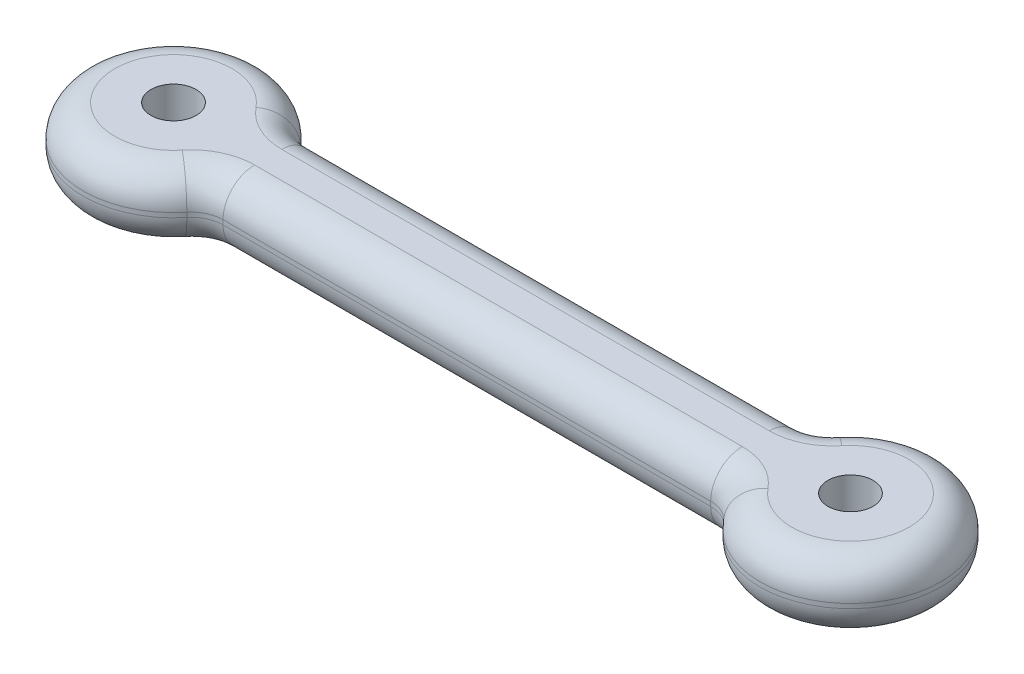
ISO-10303-21;
HEADER;
FILE_DESCRIPTION(('STEP AP214'),'2;1');
FILE_NAME('part.step','',(''),(''),'','','');
FILE_SCHEMA(('AUTOMOTIVE_DESIGN { 1 0 10303 214 1 1 1 1 }'));
ENDSEC;
DATA;
#1=APPLICATION_CONTEXT('core data for automotive mechanical design processes');
#2=APPLICATION_PROTOCOL_DEFINITION('international standard','automotive_design',2000,#1);
#3=PRODUCT_CONTEXT('',#1,'mechanical');
#4=PRODUCT('Part','Part','',(#3));
#5=PRODUCT_RELATED_PRODUCT_CATEGORY('part','',(#4));
#6=PRODUCT_DEFINITION_FORMATION('','',#4);
#7=PRODUCT_DEFINITION_CONTEXT('part definition',#1,'design');
#8=PRODUCT_DEFINITION('design','',#6,#7);
#9=PRODUCT_DEFINITION_SHAPE('','',#8);
#10=(LENGTH_UNIT() NAMED_UNIT(*) SI_UNIT(.MILLI.,.METRE.));
#11=(NAMED_UNIT(*) PLANE_ANGLE_UNIT() SI_UNIT($,.RADIAN.));
#12=(NAMED_UNIT(*) SI_UNIT($,.STERADIAN.) SOLID_ANGLE_UNIT());
#13=UNCERTAINTY_MEASURE_WITH_UNIT(LENGTH_MEASURE(1.E-05),#10,'distance_accuracy_value','');
#14=(GEOMETRIC_REPRESENTATION_CONTEXT(3) GLOBAL_UNCERTAINTY_ASSIGNED_CONTEXT((#13)) GLOBAL_UNIT_ASSIGNED_CONTEXT((#10,
#11,#12)) REPRESENTATION_CONTEXT('',''));
#15=CARTESIAN_POINT('',(0.,0.,0.));
#16=DIRECTION('',(0.,0.,1.));
#17=DIRECTION('',(1.,0.,0.));
#18=AXIS2_PLACEMENT_3D('',#15,#16,#17);
#19=CARTESIAN_POINT('',(-15.,6.,0.));
#20=DIRECTION('',(0.,1.,0.));
#21=DIRECTION('',(0.,0.,1.));
#22=AXIS2_PLACEMENT_3D('',#19,#20,#21);
#23=PLANE('',#22);
#24=CARTESIAN_POINT('',(15.,6.,0.));
#25=DIRECTION('',(0.,1.,0.));
#26=DIRECTION('',(0.,0.,1.));
#27=AXIS2_PLACEMENT_3D('',#24,#25,#26);
#28=CIRCLE('',#27,0.999999999999998);
#29=CARTESIAN_POINT('',(15.,6.,0.999999999999997));
#30=VERTEX_POINT('',#29);
#31=EDGE_CURVE('E156',#30,#30,#28,.T.);
#32=ORIENTED_EDGE('',*,*,#31,.T.);
#33=EDGE_LOOP('',(#32));
#34=FACE_BOUND('',#33,.T.);
#35=CARTESIAN_POINT('',(-15.,6.,0.));
#36=DIRECTION('',(0.,1.,0.));
#37=DIRECTION('',(0.,0.,1.));
#38=AXIS2_PLACEMENT_3D('',#35,#36,#37);
#39=CIRCLE('',#38,0.999999999999998);
#40=CARTESIAN_POINT('',(-15.,6.,0.999999999999997));
#41=VERTEX_POINT('',#40);
#42=EDGE_CURVE('E303',#41,#41,#39,.T.);
#43=ORIENTED_EDGE('',*,*,#42,.T.);
#44=EDGE_LOOP('',(#43));
#45=FACE_BOUND('',#44,.T.);
#46=CARTESIAN_POINT('',(10.8047646073194,6.,-3.4));
#47=DIRECTION('',(0.,1.,0.));
#48=DIRECTION('',(0.,0.,1.));
#49=AXIS2_PLACEMENT_3D('',#46,#47,#48);
#50=CIRCLE('',#49,2.8);
#51=CARTESIAN_POINT('',(12.9800718479686,6.,-1.63703703703704));
#52=VERTEX_POINT('',#51);
#53=CARTESIAN_POINT('',(10.8047646073194,6.,-0.6));
#54=VERTEX_POINT('',#53);
#55=EDGE_CURVE('E215',#52,#54,#50,.F.);
#56=ORIENTED_EDGE('',*,*,#55,.F.);
#57=CARTESIAN_POINT('',(15.,6.,0.));
#58=DIRECTION('',(0.,1.,0.));
#59=DIRECTION('',(0.,0.,1.));
#60=AXIS2_PLACEMENT_3D('',#57,#58,#59);
#61=CIRCLE('',#60,2.6);
#62=CARTESIAN_POINT('',(12.9800718479686,6.,1.63703703703704));
#63=VERTEX_POINT('',#62);
#64=EDGE_CURVE('E212',#52,#63,#61,.F.);
#65=ORIENTED_EDGE('',*,*,#64,.T.);
#66=CARTESIAN_POINT('',(10.8047646073194,6.,3.4));
#67=DIRECTION('',(0.,1.,0.));
#68=DIRECTION('',(0.,0.,1.));
#69=AXIS2_PLACEMENT_3D('',#66,#67,#68);
#70=CIRCLE('',#69,2.8);
#71=CARTESIAN_POINT('',(10.8047646073194,6.,0.599999999999998));
#72=VERTEX_POINT('',#71);
#73=EDGE_CURVE('E210',#72,#63,#70,.F.);
#74=ORIENTED_EDGE('',*,*,#73,.F.);
#75=DIRECTION('',(1.,0.,0.));
#76=VECTOR('',#75,1.);
#77=CARTESIAN_POINT('',(-15.,6.,0.599999999999998));
#78=LINE('',#77,#76);
#79=CARTESIAN_POINT('',(-10.8047646073194,6.,0.599999999999998));
#80=VERTEX_POINT('',#79);
#81=EDGE_CURVE('E206',#72,#80,#78,.F.);
#82=ORIENTED_EDGE('',*,*,#81,.T.);
#83=CARTESIAN_POINT('',(-10.8047646073194,6.,3.4));
#84=DIRECTION('',(0.,1.,0.));
#85=DIRECTION('',(0.,0.,1.));
#86=AXIS2_PLACEMENT_3D('',#83,#84,#85);
#87=CIRCLE('',#86,2.8);
#88=CARTESIAN_POINT('',(-12.9800718479686,6.,1.63703703703704));
#89=VERTEX_POINT('',#88);
#90=EDGE_CURVE('E203',#89,#80,#87,.F.);
#91=ORIENTED_EDGE('',*,*,#90,.F.);
#92=CARTESIAN_POINT('',(-15.,6.,0.));
#93=DIRECTION('',(0.,1.,0.));
#94=DIRECTION('',(0.,0.,1.));
#95=AXIS2_PLACEMENT_3D('',#92,#93,#94);
#96=CIRCLE('',#95,2.6);
#97=CARTESIAN_POINT('',(-12.9800718479686,6.,-1.63703703703704));
#98=VERTEX_POINT('',#97);
#99=EDGE_CURVE('E201',#89,#98,#96,.F.);
#100=ORIENTED_EDGE('',*,*,#99,.T.);
#101=CARTESIAN_POINT('',(-10.8047646073194,6.,-3.4));
#102=DIRECTION('',(0.,1.,0.));
#103=DIRECTION('',(0.,0.,1.));
#104=AXIS2_PLACEMENT_3D('',#101,#102,#103);
#105=CIRCLE('',#104,2.8);
#106=CARTESIAN_POINT('',(-10.8047646073194,6.,-0.6));
#107=VERTEX_POINT('',#106);
#108=EDGE_CURVE('E198',#107,#98,#105,.F.);
#109=ORIENTED_EDGE('',*,*,#108,.F.);
#110=DIRECTION('',(-1.,0.,0.));
#111=VECTOR('',#110,1.);
#112=CARTESIAN_POINT('',(-15.,6.,-0.6));
#113=LINE('',#112,#111);
#114=EDGE_CURVE('E208',#107,#54,#113,.F.);
#115=ORIENTED_EDGE('',*,*,#114,.T.);
#116=EDGE_LOOP('',(#56,#65,#74,#82,#91,#100,#109,#115));
#117=FACE_BOUND('',#116,.T.);
#118=ADVANCED_FACE('F34',(#34,#45,#117),#23,.F.);
#119=CARTESIAN_POINT('',(-15.,9.,0.));
#120=DIRECTION('',(0.,1.,0.));
#121=DIRECTION('',(0.,0.,1.));
#122=AXIS2_PLACEMENT_3D('',#119,#120,#121);
#123=PLANE('',#122);
#124=CARTESIAN_POINT('',(15.,9.,0.));
#125=DIRECTION('',(0.,1.,0.));
#126=DIRECTION('',(0.,0.,1.));
#127=AXIS2_PLACEMENT_3D('',#124,#125,#126);
#128=CIRCLE('',#127,0.999999999999998);
#129=CARTESIAN_POINT('',(15.,9.,0.999999999999997));
#130=VERTEX_POINT('',#129);
#131=EDGE_CURVE('E308',#130,#130,#128,.T.);
#132=ORIENTED_EDGE('',*,*,#131,.F.);
#133=EDGE_LOOP('',(#132));
#134=FACE_BOUND('',#133,.T.);
#135=CARTESIAN_POINT('',(-15.,9.,0.));
#136=DIRECTION('',(0.,1.,0.));
#137=DIRECTION('',(0.,0.,1.));
#138=AXIS2_PLACEMENT_3D('',#135,#136,#137);
#139=CIRCLE('',#138,0.999999999999998);
#140=CARTESIAN_POINT('',(-15.,9.,0.999999999999997));
#141=VERTEX_POINT('',#140);
#142=EDGE_CURVE('E298',#141,#141,#139,.T.);
#143=ORIENTED_EDGE('',*,*,#142,.F.);
#144=EDGE_LOOP('',(#143));
#145=FACE_BOUND('',#144,.T.);
#146=CARTESIAN_POINT('',(10.8047646073194,9.,3.4));
#147=DIRECTION('',(0.,1.,0.));
#148=DIRECTION('',(0.,0.,1.));
#149=AXIS2_PLACEMENT_3D('',#146,#147,#148);
#150=CIRCLE('',#149,2.8);
#151=CARTESIAN_POINT('',(12.9800718479686,9.,1.63703703703704));
#152=VERTEX_POINT('',#151);
#153=CARTESIAN_POINT('',(10.8047646073194,9.,0.599999999999998));
#154=VERTEX_POINT('',#153);
#155=EDGE_CURVE('E187',#152,#154,#150,.T.);
#156=ORIENTED_EDGE('',*,*,#155,.F.);
#157=CARTESIAN_POINT('',(15.,9.,0.));
#158=DIRECTION('',(0.,1.,0.));
#159=DIRECTION('',(0.,0.,1.));
#160=AXIS2_PLACEMENT_3D('',#157,#158,#159);
#161=CIRCLE('',#160,2.6);
#162=CARTESIAN_POINT('',(12.9800718479686,9.,-1.63703703703704));
#163=VERTEX_POINT('',#162);
#164=EDGE_CURVE('E184',#152,#163,#161,.T.);
#165=ORIENTED_EDGE('',*,*,#164,.T.);
#166=CARTESIAN_POINT('',(10.8047646073194,9.,-3.4));
#167=DIRECTION('',(0.,1.,0.));
#168=DIRECTION('',(0.,0.,1.));
#169=AXIS2_PLACEMENT_3D('',#166,#167,#168);
#170=CIRCLE('',#169,2.8);
#171=CARTESIAN_POINT('',(10.8047646073194,9.,-0.6));
#172=VERTEX_POINT('',#171);
#173=EDGE_CURVE('E181',#172,#163,#170,.T.);
#174=ORIENTED_EDGE('',*,*,#173,.F.);
#175=DIRECTION('',(-1.,0.,0.));
#176=VECTOR('',#175,1.);
#177=CARTESIAN_POINT('',(-11.5358983848622,9.,-0.6));
#178=LINE('',#177,#176);
#179=CARTESIAN_POINT('',(-10.8047646073194,9.,-0.6));
#180=VERTEX_POINT('',#179);
#181=EDGE_CURVE('E176',#172,#180,#178,.T.);
#182=ORIENTED_EDGE('',*,*,#181,.T.);
#183=CARTESIAN_POINT('',(-10.8047646073194,9.,-3.4));
#184=DIRECTION('',(0.,1.,0.));
#185=DIRECTION('',(0.,0.,1.));
#186=AXIS2_PLACEMENT_3D('',#183,#184,#185);
#187=CIRCLE('',#186,2.8);
#188=CARTESIAN_POINT('',(-12.9800718479686,9.,-1.63703703703704));
#189=VERTEX_POINT('',#188);
#190=EDGE_CURVE('E173',#189,#180,#187,.T.);
#191=ORIENTED_EDGE('',*,*,#190,.F.);
#192=CARTESIAN_POINT('',(-15.,9.,0.));
#193=DIRECTION('',(0.,1.,0.));
#194=DIRECTION('',(0.,0.,1.));
#195=AXIS2_PLACEMENT_3D('',#192,#193,#194);
#196=CIRCLE('',#195,2.6);
#197=CARTESIAN_POINT('',(-12.9800718479686,9.,1.63703703703704));
#198=VERTEX_POINT('',#197);
#199=EDGE_CURVE('E152',#189,#198,#196,.T.);
#200=ORIENTED_EDGE('',*,*,#199,.T.);
#201=CARTESIAN_POINT('',(-10.8047646073194,9.,3.4));
#202=DIRECTION('',(0.,1.,0.));
#203=DIRECTION('',(0.,0.,1.));
#204=AXIS2_PLACEMENT_3D('',#201,#202,#203);
#205=CIRCLE('',#204,2.8);
#206=CARTESIAN_POINT('',(-10.8047646073194,9.,0.599999999999998));
#207=VERTEX_POINT('',#206);
#208=EDGE_CURVE('E145',#207,#198,#205,.T.);
#209=ORIENTED_EDGE('',*,*,#208,.F.);
#210=DIRECTION('',(1.,0.,0.));
#211=VECTOR('',#210,1.);
#212=CARTESIAN_POINT('',(11.5358983848622,9.,0.599999999999998));
#213=LINE('',#212,#211);
#214=EDGE_CURVE('E149',#207,#154,#213,.T.);
#215=ORIENTED_EDGE('',*,*,#214,.T.);
#216=EDGE_LOOP('',(#156,#165,#174,#182,#191,#200,#209,#215));
#217=FACE_BOUND('',#216,.T.);
#218=ADVANCED_FACE('F147',(#134,#145,#217),#123,.T.);
#219=CARTESIAN_POINT('',(-15.,9.,0.));
#220=DIRECTION('',(0.,-1.,0.));
#221=DIRECTION('',(0.,0.,-1.));
#222=AXIS2_PLACEMENT_3D('',#219,#220,#221);
#223=CYLINDRICAL_SURFACE('',#222,4.);
#224=CARTESIAN_POINT('',(-15.,7.6,0.));
#225=DIRECTION('',(0.,1.,0.));
#226=DIRECTION('',(0.,0.,1.));
#227=AXIS2_PLACEMENT_3D('',#224,#225,#226);
#228=CIRCLE('',#227,4.);
#229=CARTESIAN_POINT('',(-11.892418227644,7.6,2.51851851851852));
#230=VERTEX_POINT('',#229);
#231=CARTESIAN_POINT('',(-11.892418227644,7.6,-2.51851851851852));
#232=VERTEX_POINT('',#231);
#233=EDGE_CURVE('E43',#230,#232,#228,.F.);
#234=ORIENTED_EDGE('',*,*,#233,.T.);
#235=DIRECTION('',(0.,-1.,0.));
#236=VECTOR('',#235,1.);
#237=CARTESIAN_POINT('',(-11.892418227644,9.,-2.51851851851852));
#238=LINE('',#237,#236);
#239=CARTESIAN_POINT('',(-11.892418227644,7.4,-2.51851851851852));
#240=VERTEX_POINT('',#239);
#241=EDGE_CURVE('E11',#232,#240,#238,.T.);
#242=ORIENTED_EDGE('',*,*,#241,.T.);
#243=CARTESIAN_POINT('',(-15.,7.4,0.));
#244=DIRECTION('',(0.,1.,0.));
#245=DIRECTION('',(0.,0.,1.));
#246=AXIS2_PLACEMENT_3D('',#243,#244,#245);
#247=CIRCLE('',#246,4.);
#248=CARTESIAN_POINT('',(-11.892418227644,7.4,2.51851851851852));
#249=VERTEX_POINT('',#248);
#250=EDGE_CURVE('E236',#240,#249,#247,.T.);
#251=ORIENTED_EDGE('',*,*,#250,.T.);
#252=DIRECTION('',(0.,-1.,0.));
#253=VECTOR('',#252,1.);
#254=CARTESIAN_POINT('',(-11.892418227644,9.,2.51851851851852));
#255=LINE('',#254,#253);
#256=EDGE_CURVE('E54',#249,#230,#255,.F.);
#257=ORIENTED_EDGE('',*,*,#256,.T.);
#258=EDGE_LOOP('',(#234,#242,#251,#257));
#259=FACE_BOUND('',#258,.T.);
#260=ADVANCED_FACE('F328',(#259),#223,.T.);
#261=CARTESIAN_POINT('',(11.5358983848622,9.,2.));
#262=DIRECTION('',(0.,0.,-1.));
#263=DIRECTION('',(-1.,0.,0.));
#264=AXIS2_PLACEMENT_3D('',#261,#262,#263);
#265=PLANE('',#264);
#266=DIRECTION('',(0.,1.,0.));
#267=VECTOR('',#266,1.);
#268=CARTESIAN_POINT('',(10.8047646073194,9.,2.));
#269=LINE('',#268,#267);
#270=CARTESIAN_POINT('',(10.8047646073194,7.4,2.));
#271=VERTEX_POINT('',#270);
#272=CARTESIAN_POINT('',(10.8047646073194,7.6,2.));
#273=VERTEX_POINT('',#272);
#274=EDGE_CURVE('E231',#271,#273,#269,.T.);
#275=ORIENTED_EDGE('',*,*,#274,.T.);
#276=DIRECTION('',(1.,0.,0.));
#277=VECTOR('',#276,1.);
#278=CARTESIAN_POINT('',(-11.5358983848622,7.6,2.));
#279=LINE('',#278,#277);
#280=CARTESIAN_POINT('',(-10.8047646073194,7.6,2.));
#281=VERTEX_POINT('',#280);
#282=EDGE_CURVE('E233',#273,#281,#279,.F.);
#283=ORIENTED_EDGE('',*,*,#282,.T.);
#284=DIRECTION('',(0.,1.,0.));
#285=VECTOR('',#284,1.);
#286=CARTESIAN_POINT('',(-10.8047646073194,6.,2.));
#287=LINE('',#286,#285);
#288=CARTESIAN_POINT('',(-10.8047646073194,7.4,2.));
#289=VERTEX_POINT('',#288);
#290=EDGE_CURVE('E227',#281,#289,#287,.F.);
#291=ORIENTED_EDGE('',*,*,#290,.T.);
#292=DIRECTION('',(1.,0.,0.));
#293=VECTOR('',#292,1.);
#294=CARTESIAN_POINT('',(11.5358983848622,7.4,2.));
#295=LINE('',#294,#293);
#296=EDGE_CURVE('E229',#289,#271,#295,.T.);
#297=ORIENTED_EDGE('',*,*,#296,.T.);
#298=EDGE_LOOP('',(#275,#283,#291,#297));
#299=FACE_BOUND('',#298,.T.);
#300=ADVANCED_FACE('F334',(#299),#265,.F.);
#301=CARTESIAN_POINT('',(15.,9.,0.));
#302=DIRECTION('',(0.,-1.,0.));
#303=DIRECTION('',(0.,0.,-1.));
#304=AXIS2_PLACEMENT_3D('',#301,#302,#303);
#305=CYLINDRICAL_SURFACE('',#304,4.);
#306=CARTESIAN_POINT('',(15.,7.4,0.));
#307=DIRECTION('',(0.,1.,0.));
#308=DIRECTION('',(0.,0.,1.));
#309=AXIS2_PLACEMENT_3D('',#306,#307,#308);
#310=CIRCLE('',#309,4.);
#311=CARTESIAN_POINT('',(11.892418227644,7.4,2.51851851851852));
#312=VERTEX_POINT('',#311);
#313=CARTESIAN_POINT('',(11.892418227644,7.4,-2.51851851851852));
#314=VERTEX_POINT('',#313);
#315=EDGE_CURVE('E191',#312,#314,#310,.T.);
#316=ORIENTED_EDGE('',*,*,#315,.T.);
#317=DIRECTION('',(0.,-1.,0.));
#318=VECTOR('',#317,1.);
#319=CARTESIAN_POINT('',(11.892418227644,9.,-2.51851851851852));
#320=LINE('',#319,#318);
#321=CARTESIAN_POINT('',(11.892418227644,7.6,-2.51851851851852));
#322=VERTEX_POINT('',#321);
#323=EDGE_CURVE('E196',#314,#322,#320,.F.);
#324=ORIENTED_EDGE('',*,*,#323,.T.);
#325=CARTESIAN_POINT('',(15.,7.6,0.));
#326=DIRECTION('',(0.,1.,0.));
#327=DIRECTION('',(0.,0.,1.));
#328=AXIS2_PLACEMENT_3D('',#325,#326,#327);
#329=CIRCLE('',#328,4.);
#330=CARTESIAN_POINT('',(11.892418227644,7.6,2.51851851851852));
#331=VERTEX_POINT('',#330);
#332=EDGE_CURVE('E193',#322,#331,#329,.F.);
#333=ORIENTED_EDGE('',*,*,#332,.T.);
#334=DIRECTION('',(0.,-1.,0.));
#335=VECTOR('',#334,1.);
#336=CARTESIAN_POINT('',(11.892418227644,9.,2.51851851851852));
#337=LINE('',#336,#335);
#338=EDGE_CURVE('E189',#331,#312,#337,.T.);
#339=ORIENTED_EDGE('',*,*,#338,.T.);
#340=EDGE_LOOP('',(#316,#324,#333,#339));
#341=FACE_BOUND('',#340,.T.);
#342=ADVANCED_FACE('F341',(#341),#305,.T.);
#343=CARTESIAN_POINT('',(11.5358983848622,9.,-2.));
#344=DIRECTION('',(0.,0.,1.));
#345=DIRECTION('',(1.,0.,0.));
#346=AXIS2_PLACEMENT_3D('',#343,#344,#345);
#347=PLANE('',#346);
#348=DIRECTION('',(-1.,0.,0.));
#349=VECTOR('',#348,1.);
#350=CARTESIAN_POINT('',(11.5358983848622,7.6,-2.));
#351=LINE('',#350,#349);
#352=CARTESIAN_POINT('',(-10.8047646073194,7.6,-2.));
#353=VERTEX_POINT('',#352);
#354=CARTESIAN_POINT('',(10.8047646073194,7.6,-2.));
#355=VERTEX_POINT('',#354);
#356=EDGE_CURVE('E222',#353,#355,#351,.F.);
#357=ORIENTED_EDGE('',*,*,#356,.T.);
#358=DIRECTION('',(0.,1.,0.));
#359=VECTOR('',#358,1.);
#360=CARTESIAN_POINT('',(10.8047646073194,6.,-2.));
#361=LINE('',#360,#359);
#362=CARTESIAN_POINT('',(10.8047646073194,7.4,-2.));
#363=VERTEX_POINT('',#362);
#364=EDGE_CURVE('E224',#355,#363,#361,.F.);
#365=ORIENTED_EDGE('',*,*,#364,.T.);
#366=DIRECTION('',(-1.,0.,0.));
#367=VECTOR('',#366,1.);
#368=CARTESIAN_POINT('',(11.5358983848622,7.4,-2.));
#369=LINE('',#368,#367);
#370=CARTESIAN_POINT('',(-10.8047646073194,7.4,-2.));
#371=VERTEX_POINT('',#370);
#372=EDGE_CURVE('E220',#363,#371,#369,.T.);
#373=ORIENTED_EDGE('',*,*,#372,.T.);
#374=DIRECTION('',(0.,1.,0.));
#375=VECTOR('',#374,1.);
#376=CARTESIAN_POINT('',(-10.8047646073194,9.,-2.));
#377=LINE('',#376,#375);
#378=EDGE_CURVE('E218',#371,#353,#377,.T.);
#379=ORIENTED_EDGE('',*,*,#378,.T.);
#380=EDGE_LOOP('',(#357,#365,#373,#379));
#381=FACE_BOUND('',#380,.T.);
#382=ADVANCED_FACE('F322',(#381),#347,.F.);
#383=CARTESIAN_POINT('',(15.,9.,0.));
#384=DIRECTION('',(0.,1.,0.));
#385=DIRECTION('',(0.,0.,1.));
#386=AXIS2_PLACEMENT_3D('',#383,#384,#385);
#387=CYLINDRICAL_SURFACE('',#386,0.999999999999998);
#388=ORIENTED_EDGE('',*,*,#31,.F.);
#389=EDGE_LOOP('',(#388));
#390=FACE_BOUND('',#389,.T.);
#391=ORIENTED_EDGE('',*,*,#131,.T.);
#392=EDGE_LOOP('',(#391));
#393=FACE_BOUND('',#392,.T.);
#394=ADVANCED_FACE('F318',(#390,#393),#387,.F.);
#395=CARTESIAN_POINT('',(-15.,9.,0.));
#396=DIRECTION('',(0.,1.,0.));
#397=DIRECTION('',(0.,0.,1.));
#398=AXIS2_PLACEMENT_3D('',#395,#396,#397);
#399=CYLINDRICAL_SURFACE('',#398,0.999999999999998);
#400=ORIENTED_EDGE('',*,*,#42,.F.);
#401=EDGE_LOOP('',(#400));
#402=FACE_BOUND('',#401,.T.);
#403=ORIENTED_EDGE('',*,*,#142,.T.);
#404=EDGE_LOOP('',(#403));
#405=FACE_BOUND('',#404,.T.);
#406=ADVANCED_FACE('F321',(#402,#405),#399,.F.);
#407=CARTESIAN_POINT('',(-15.,7.4,0.));
#408=DIRECTION('',(0.,1.,0.));
#409=DIRECTION('',(0.,0.,1.));
#410=AXIS2_PLACEMENT_3D('',#407,#408,#409);
#411=TOROIDAL_SURFACE('',#410,2.6,1.4);
#412=CARTESIAN_POINT('',(-12.9800718479686,7.4,-1.63703703703704));
#413=DIRECTION('',(0.629629629629629,0.,0.776895443089002));
#414=DIRECTION('',(0.776895443089002,0.,-0.629629629629629));
#415=AXIS2_PLACEMENT_3D('',#412,#413,#414);
#416=CIRCLE('',#415,1.4);
#417=EDGE_CURVE('E291',#98,#240,#416,.T.);
#418=ORIENTED_EDGE('',*,*,#417,.F.);
#419=ORIENTED_EDGE('',*,*,#99,.F.);
#420=CARTESIAN_POINT('',(-12.9800718479686,7.4,1.63703703703704));
#421=DIRECTION('',(0.629629629629629,0.,-0.776895443089002));
#422=DIRECTION('',(-0.776895443089002,0.,-0.629629629629629));
#423=AXIS2_PLACEMENT_3D('',#420,#421,#422);
#424=CIRCLE('',#423,1.4);
#425=EDGE_CURVE('E38',#249,#89,#424,.T.);
#426=ORIENTED_EDGE('',*,*,#425,.F.);
#427=ORIENTED_EDGE('',*,*,#250,.F.);
#428=EDGE_LOOP('',(#418,#419,#426,#427));
#429=FACE_BOUND('',#428,.T.);
#430=ADVANCED_FACE('F36',(#429),#411,.T.);
#431=CARTESIAN_POINT('',(-10.8047646073194,7.4,3.4));
#432=DIRECTION('',(0.,1.,0.));
#433=DIRECTION('',(0.,0.,1.));
#434=AXIS2_PLACEMENT_3D('',#431,#432,#433);
#435=TOROIDAL_SURFACE('',#434,2.8,1.4);
#436=ORIENTED_EDGE('',*,*,#425,.T.);
#437=ORIENTED_EDGE('',*,*,#90,.T.);
#438=CARTESIAN_POINT('',(-10.8047646073194,7.4,0.599999999999998));
#439=DIRECTION('',(-1.,0.,0.));
#440=DIRECTION('',(0.,0.,1.));
#441=AXIS2_PLACEMENT_3D('',#438,#439,#440);
#442=CIRCLE('',#441,1.4);
#443=EDGE_CURVE('E289',#289,#80,#442,.F.);
#444=ORIENTED_EDGE('',*,*,#443,.F.);
#445=CARTESIAN_POINT('',(-10.8047646073194,7.4,3.4));
#446=DIRECTION('',(0.,1.,0.));
#447=DIRECTION('',(0.,0.,1.));
#448=AXIS2_PLACEMENT_3D('',#445,#446,#447);
#449=CIRCLE('',#448,1.4);
#450=EDGE_CURVE('E286',#249,#289,#449,.F.);
#451=ORIENTED_EDGE('',*,*,#450,.F.);
#452=EDGE_LOOP('',(#436,#437,#444,#451));
#453=FACE_BOUND('',#452,.T.);
#454=ADVANCED_FACE('F415',(#453),#435,.T.);
#455=CARTESIAN_POINT('',(-10.8047646073194,7.4,-3.4));
#456=DIRECTION('',(0.,1.,0.));
#457=DIRECTION('',(0.,0.,1.));
#458=AXIS2_PLACEMENT_3D('',#455,#456,#457);
#459=TOROIDAL_SURFACE('',#458,2.8,1.4);
#460=ORIENTED_EDGE('',*,*,#108,.T.);
#461=ORIENTED_EDGE('',*,*,#417,.T.);
#462=CARTESIAN_POINT('',(-10.8047646073194,7.4,-3.4));
#463=DIRECTION('',(0.,1.,0.));
#464=DIRECTION('',(0.,0.,1.));
#465=AXIS2_PLACEMENT_3D('',#462,#463,#464);
#466=CIRCLE('',#465,1.4);
#467=EDGE_CURVE('E284',#371,#240,#466,.F.);
#468=ORIENTED_EDGE('',*,*,#467,.F.);
#469=CARTESIAN_POINT('',(-10.8047646073194,7.4,-0.6));
#470=DIRECTION('',(-1.,0.,0.));
#471=DIRECTION('',(0.,0.,1.));
#472=AXIS2_PLACEMENT_3D('',#469,#470,#471);
#473=CIRCLE('',#472,1.4);
#474=EDGE_CURVE('E281',#107,#371,#473,.F.);
#475=ORIENTED_EDGE('',*,*,#474,.F.);
#476=EDGE_LOOP('',(#460,#461,#468,#475));
#477=FACE_BOUND('',#476,.T.);
#478=ADVANCED_FACE('F412',(#477),#459,.T.);
#479=CARTESIAN_POINT('',(11.5358983848622,7.4,0.599999999999998));
#480=DIRECTION('',(1.,0.,0.));
#481=DIRECTION('',(0.,0.,-1.));
#482=AXIS2_PLACEMENT_3D('',#479,#480,#481);
#483=CYLINDRICAL_SURFACE('',#482,1.4);
#484=ORIENTED_EDGE('',*,*,#443,.T.);
#485=ORIENTED_EDGE('',*,*,#81,.F.);
#486=CARTESIAN_POINT('',(10.8047646073194,7.4,0.599999999999998));
#487=DIRECTION('',(1.,0.,0.));
#488=DIRECTION('',(0.,0.,-1.));
#489=AXIS2_PLACEMENT_3D('',#486,#487,#488);
#490=CIRCLE('',#489,1.4);
#491=EDGE_CURVE('E275',#271,#72,#490,.T.);
#492=ORIENTED_EDGE('',*,*,#491,.F.);
#493=ORIENTED_EDGE('',*,*,#296,.F.);
#494=EDGE_LOOP('',(#484,#485,#492,#493));
#495=FACE_BOUND('',#494,.T.);
#496=ADVANCED_FACE('F408',(#495),#483,.T.);
#497=CARTESIAN_POINT('',(-10.8047646073194,9.,3.4));
#498=DIRECTION('',(0.,-1.,0.));
#499=DIRECTION('',(0.,0.,-1.));
#500=AXIS2_PLACEMENT_3D('',#497,#498,#499);
#501=CYLINDRICAL_SURFACE('',#500,1.4);
#502=ORIENTED_EDGE('',*,*,#450,.T.);
#503=ORIENTED_EDGE('',*,*,#290,.F.);
#504=CARTESIAN_POINT('',(-10.8047646073194,7.6,3.4));
#505=DIRECTION('',(0.,1.,0.));
#506=DIRECTION('',(0.,0.,1.));
#507=AXIS2_PLACEMENT_3D('',#504,#505,#506);
#508=CIRCLE('',#507,1.4);
#509=EDGE_CURVE('E162',#230,#281,#508,.F.);
#510=ORIENTED_EDGE('',*,*,#509,.F.);
#511=ORIENTED_EDGE('',*,*,#256,.F.);
#512=EDGE_LOOP('',(#502,#503,#510,#511));
#513=FACE_BOUND('',#512,.T.);
#514=ADVANCED_FACE('F404',(#513),#501,.F.);
#515=CARTESIAN_POINT('',(-15.,7.6,0.));
#516=DIRECTION('',(0.,1.,0.));
#517=DIRECTION('',(0.,0.,1.));
#518=AXIS2_PLACEMENT_3D('',#515,#516,#517);
#519=TOROIDAL_SURFACE('',#518,2.6,1.4);
#520=CARTESIAN_POINT('',(-12.9800718479686,7.6,-1.63703703703704));
#521=DIRECTION('',(0.629629629629629,0.,0.776895443089002));
#522=DIRECTION('',(0.776895443089002,0.,-0.629629629629629));
#523=AXIS2_PLACEMENT_3D('',#520,#521,#522);
#524=CIRCLE('',#523,1.4);
#525=EDGE_CURVE('E269',#232,#189,#524,.T.);
#526=ORIENTED_EDGE('',*,*,#525,.F.);
#527=ORIENTED_EDGE('',*,*,#233,.F.);
#528=CARTESIAN_POINT('',(-12.9800718479686,7.6,1.63703703703704));
#529=DIRECTION('',(0.629629629629629,0.,-0.776895443089002));
#530=DIRECTION('',(-0.776895443089002,0.,-0.629629629629629));
#531=AXIS2_PLACEMENT_3D('',#528,#529,#530);
#532=CIRCLE('',#531,1.4);
#533=EDGE_CURVE('E272',#198,#230,#532,.T.);
#534=ORIENTED_EDGE('',*,*,#533,.F.);
#535=ORIENTED_EDGE('',*,*,#199,.F.);
#536=EDGE_LOOP('',(#526,#527,#534,#535));
#537=FACE_BOUND('',#536,.T.);
#538=ADVANCED_FACE('F400',(#537),#519,.T.);
#539=CARTESIAN_POINT('',(-10.8047646073194,9.,-3.4));
#540=DIRECTION('',(0.,-1.,0.));
#541=DIRECTION('',(0.,0.,-1.));
#542=AXIS2_PLACEMENT_3D('',#539,#540,#541);
#543=CYLINDRICAL_SURFACE('',#542,1.4);
#544=ORIENTED_EDGE('',*,*,#467,.T.);
#545=ORIENTED_EDGE('',*,*,#241,.F.);
#546=CARTESIAN_POINT('',(-10.8047646073194,7.6,-3.4));
#547=DIRECTION('',(0.,1.,0.));
#548=DIRECTION('',(0.,0.,1.));
#549=AXIS2_PLACEMENT_3D('',#546,#547,#548);
#550=CIRCLE('',#549,1.4);
#551=EDGE_CURVE('E266',#353,#232,#550,.F.);
#552=ORIENTED_EDGE('',*,*,#551,.F.);
#553=ORIENTED_EDGE('',*,*,#378,.F.);
#554=EDGE_LOOP('',(#544,#545,#552,#553));
#555=FACE_BOUND('',#554,.T.);
#556=ADVANCED_FACE('F396',(#555),#543,.F.);
#557=CARTESIAN_POINT('',(11.5358983848622,7.4,-0.6));
#558=DIRECTION('',(-1.,0.,0.));
#559=DIRECTION('',(0.,0.,1.));
#560=AXIS2_PLACEMENT_3D('',#557,#558,#559);
#561=CYLINDRICAL_SURFACE('',#560,1.4);
#562=ORIENTED_EDGE('',*,*,#474,.T.);
#563=ORIENTED_EDGE('',*,*,#372,.F.);
#564=CARTESIAN_POINT('',(10.8047646073194,7.4,-0.6));
#565=DIRECTION('',(1.,0.,0.));
#566=DIRECTION('',(0.,0.,-1.));
#567=AXIS2_PLACEMENT_3D('',#564,#565,#566);
#568=CIRCLE('',#567,1.4);
#569=EDGE_CURVE('E263',#54,#363,#568,.T.);
#570=ORIENTED_EDGE('',*,*,#569,.F.);
#571=ORIENTED_EDGE('',*,*,#114,.F.);
#572=EDGE_LOOP('',(#562,#563,#570,#571));
#573=FACE_BOUND('',#572,.T.);
#574=ADVANCED_FACE('F392',(#573),#561,.T.);
#575=CARTESIAN_POINT('',(15.,7.4,0.));
#576=DIRECTION('',(0.,1.,0.));
#577=DIRECTION('',(0.,0.,1.));
#578=AXIS2_PLACEMENT_3D('',#575,#576,#577);
#579=TOROIDAL_SURFACE('',#578,2.6,1.4);
#580=CARTESIAN_POINT('',(12.9800718479686,7.4,1.63703703703704));
#581=DIRECTION('',(-0.629629629629629,0.,-0.776895443089002));
#582=DIRECTION('',(-0.776895443089002,0.,0.629629629629629));
#583=AXIS2_PLACEMENT_3D('',#580,#581,#582);
#584=CIRCLE('',#583,1.4);
#585=EDGE_CURVE('E278',#63,#312,#584,.T.);
#586=ORIENTED_EDGE('',*,*,#585,.F.);
#587=ORIENTED_EDGE('',*,*,#64,.F.);
#588=CARTESIAN_POINT('',(12.9800718479686,7.4,-1.63703703703704));
#589=DIRECTION('',(-0.629629629629629,0.,0.776895443089002));
#590=DIRECTION('',(0.776895443089002,0.,0.629629629629629));
#591=AXIS2_PLACEMENT_3D('',#588,#589,#590);
#592=CIRCLE('',#591,1.4);
#593=EDGE_CURVE('E260',#314,#52,#592,.T.);
#594=ORIENTED_EDGE('',*,*,#593,.F.);
#595=ORIENTED_EDGE('',*,*,#315,.F.);
#596=EDGE_LOOP('',(#586,#587,#594,#595));
#597=FACE_BOUND('',#596,.T.);
#598=ADVANCED_FACE('F388',(#597),#579,.T.);
#599=CARTESIAN_POINT('',(10.8047646073194,7.4,3.4));
#600=DIRECTION('',(0.,1.,0.));
#601=DIRECTION('',(0.,0.,1.));
#602=AXIS2_PLACEMENT_3D('',#599,#600,#601);
#603=TOROIDAL_SURFACE('',#602,2.8,1.4);
#604=ORIENTED_EDGE('',*,*,#73,.T.);
#605=ORIENTED_EDGE('',*,*,#585,.T.);
#606=CARTESIAN_POINT('',(10.8047646073194,7.4,3.4));
#607=DIRECTION('',(0.,1.,0.));
#608=DIRECTION('',(0.,0.,1.));
#609=AXIS2_PLACEMENT_3D('',#606,#607,#608);
#610=CIRCLE('',#609,1.4);
#611=EDGE_CURVE('E166',#271,#312,#610,.F.);
#612=ORIENTED_EDGE('',*,*,#611,.F.);
#613=ORIENTED_EDGE('',*,*,#491,.T.);
#614=EDGE_LOOP('',(#604,#605,#612,#613));
#615=FACE_BOUND('',#614,.T.);
#616=ADVANCED_FACE('F385',(#615),#603,.T.);
#617=CARTESIAN_POINT('',(-10.8047646073194,7.6,3.4));
#618=DIRECTION('',(0.,1.,0.));
#619=DIRECTION('',(0.,0.,1.));
#620=AXIS2_PLACEMENT_3D('',#617,#618,#619);
#621=TOROIDAL_SURFACE('',#620,2.8,1.4);
#622=ORIENTED_EDGE('',*,*,#533,.T.);
#623=ORIENTED_EDGE('',*,*,#509,.T.);
#624=CARTESIAN_POINT('',(-10.8047646073194,7.6,0.599999999999998));
#625=DIRECTION('',(-1.,0.,0.));
#626=DIRECTION('',(0.,0.,1.));
#627=AXIS2_PLACEMENT_3D('',#624,#625,#626);
#628=CIRCLE('',#627,1.4);
#629=EDGE_CURVE('E159',#207,#281,#628,.F.);
#630=ORIENTED_EDGE('',*,*,#629,.F.);
#631=ORIENTED_EDGE('',*,*,#208,.T.);
#632=EDGE_LOOP('',(#622,#623,#630,#631));
#633=FACE_BOUND('',#632,.T.);
#634=ADVANCED_FACE('F160',(#633),#621,.T.);
#635=CARTESIAN_POINT('',(-10.8047646073194,7.6,-3.4));
#636=DIRECTION('',(0.,1.,0.));
#637=DIRECTION('',(0.,0.,1.));
#638=AXIS2_PLACEMENT_3D('',#635,#636,#637);
#639=TOROIDAL_SURFACE('',#638,2.8,1.4);
#640=ORIENTED_EDGE('',*,*,#525,.T.);
#641=ORIENTED_EDGE('',*,*,#190,.T.);
#642=CARTESIAN_POINT('',(-10.8047646073194,7.6,-0.6));
#643=DIRECTION('',(-1.,0.,0.));
#644=DIRECTION('',(0.,0.,1.));
#645=AXIS2_PLACEMENT_3D('',#642,#643,#644);
#646=CIRCLE('',#645,1.4);
#647=EDGE_CURVE('E167',#353,#180,#646,.F.);
#648=ORIENTED_EDGE('',*,*,#647,.F.);
#649=ORIENTED_EDGE('',*,*,#551,.T.);
#650=EDGE_LOOP('',(#640,#641,#648,#649));
#651=FACE_BOUND('',#650,.T.);
#652=ADVANCED_FACE('F378',(#651),#639,.T.);
#653=CARTESIAN_POINT('',(10.8047646073194,7.4,-3.4));
#654=DIRECTION('',(0.,1.,0.));
#655=DIRECTION('',(0.,0.,1.));
#656=AXIS2_PLACEMENT_3D('',#653,#654,#655);
#657=TOROIDAL_SURFACE('',#656,2.8,1.4);
#658=ORIENTED_EDGE('',*,*,#55,.T.);
#659=ORIENTED_EDGE('',*,*,#569,.T.);
#660=CARTESIAN_POINT('',(10.8047646073194,7.4,-3.4));
#661=DIRECTION('',(0.,1.,0.));
#662=DIRECTION('',(0.,0.,1.));
#663=AXIS2_PLACEMENT_3D('',#660,#661,#662);
#664=CIRCLE('',#663,1.4);
#665=EDGE_CURVE('E254',#314,#363,#664,.F.);
#666=ORIENTED_EDGE('',*,*,#665,.F.);
#667=ORIENTED_EDGE('',*,*,#593,.T.);
#668=EDGE_LOOP('',(#658,#659,#666,#667));
#669=FACE_BOUND('',#668,.T.);
#670=ADVANCED_FACE('F374',(#669),#657,.T.);
#671=CARTESIAN_POINT('',(10.8047646073194,9.,3.4));
#672=DIRECTION('',(0.,-1.,0.));
#673=DIRECTION('',(0.,0.,-1.));
#674=AXIS2_PLACEMENT_3D('',#671,#672,#673);
#675=CYLINDRICAL_SURFACE('',#674,1.4);
#676=ORIENTED_EDGE('',*,*,#611,.T.);
#677=ORIENTED_EDGE('',*,*,#338,.F.);
#678=CARTESIAN_POINT('',(10.8047646073194,7.6,3.4));
#679=DIRECTION('',(0.,1.,0.));
#680=DIRECTION('',(0.,0.,1.));
#681=AXIS2_PLACEMENT_3D('',#678,#679,#680);
#682=CIRCLE('',#681,1.4);
#683=EDGE_CURVE('E251',#273,#331,#682,.F.);
#684=ORIENTED_EDGE('',*,*,#683,.F.);
#685=ORIENTED_EDGE('',*,*,#274,.F.);
#686=EDGE_LOOP('',(#676,#677,#684,#685));
#687=FACE_BOUND('',#686,.T.);
#688=ADVANCED_FACE('F371',(#687),#675,.F.);
#689=CARTESIAN_POINT('',(-15.,7.6,0.599999999999998));
#690=DIRECTION('',(-1.,0.,0.));
#691=DIRECTION('',(0.,0.,1.));
#692=AXIS2_PLACEMENT_3D('',#689,#690,#691);
#693=CYLINDRICAL_SURFACE('',#692,1.4);
#694=ORIENTED_EDGE('',*,*,#629,.T.);
#695=ORIENTED_EDGE('',*,*,#282,.F.);
#696=CARTESIAN_POINT('',(10.8047646073194,7.6,0.599999999999998));
#697=DIRECTION('',(1.,0.,0.));
#698=DIRECTION('',(0.,0.,-1.));
#699=AXIS2_PLACEMENT_3D('',#696,#697,#698);
#700=CIRCLE('',#699,1.4);
#701=EDGE_CURVE('E171',#154,#273,#700,.T.);
#702=ORIENTED_EDGE('',*,*,#701,.F.);
#703=ORIENTED_EDGE('',*,*,#214,.F.);
#704=EDGE_LOOP('',(#694,#695,#702,#703));
#705=FACE_BOUND('',#704,.T.);
#706=ADVANCED_FACE('F169',(#705),#693,.T.);
#707=CARTESIAN_POINT('',(-15.,7.6,-0.6));
#708=DIRECTION('',(1.,0.,0.));
#709=DIRECTION('',(0.,0.,-1.));
#710=AXIS2_PLACEMENT_3D('',#707,#708,#709);
#711=CYLINDRICAL_SURFACE('',#710,1.4);
#712=ORIENTED_EDGE('',*,*,#647,.T.);
#713=ORIENTED_EDGE('',*,*,#181,.F.);
#714=CARTESIAN_POINT('',(10.8047646073194,7.6,-0.6));
#715=DIRECTION('',(1.,0.,0.));
#716=DIRECTION('',(0.,0.,-1.));
#717=AXIS2_PLACEMENT_3D('',#714,#715,#716);
#718=CIRCLE('',#717,1.4);
#719=EDGE_CURVE('E247',#355,#172,#718,.T.);
#720=ORIENTED_EDGE('',*,*,#719,.F.);
#721=ORIENTED_EDGE('',*,*,#356,.F.);
#722=EDGE_LOOP('',(#712,#713,#720,#721));
#723=FACE_BOUND('',#722,.T.);
#724=ADVANCED_FACE('F364',(#723),#711,.T.);
#725=CARTESIAN_POINT('',(10.8047646073194,9.,-3.4));
#726=DIRECTION('',(0.,-1.,0.));
#727=DIRECTION('',(0.,0.,-1.));
#728=AXIS2_PLACEMENT_3D('',#725,#726,#727);
#729=CYLINDRICAL_SURFACE('',#728,1.4);
#730=ORIENTED_EDGE('',*,*,#665,.T.);
#731=ORIENTED_EDGE('',*,*,#364,.F.);
#732=CARTESIAN_POINT('',(10.8047646073194,7.6,-3.4));
#733=DIRECTION('',(0.,1.,0.));
#734=DIRECTION('',(0.,0.,1.));
#735=AXIS2_PLACEMENT_3D('',#732,#733,#734);
#736=CIRCLE('',#735,1.4);
#737=EDGE_CURVE('E244',#322,#355,#736,.F.);
#738=ORIENTED_EDGE('',*,*,#737,.F.);
#739=ORIENTED_EDGE('',*,*,#323,.F.);
#740=EDGE_LOOP('',(#730,#731,#738,#739));
#741=FACE_BOUND('',#740,.T.);
#742=ADVANCED_FACE('F360',(#741),#729,.F.);
#743=CARTESIAN_POINT('',(10.8047646073194,7.6,3.4));
#744=DIRECTION('',(0.,1.,0.));
#745=DIRECTION('',(0.,0.,1.));
#746=AXIS2_PLACEMENT_3D('',#743,#744,#745);
#747=TOROIDAL_SURFACE('',#746,2.8,1.4);
#748=ORIENTED_EDGE('',*,*,#701,.T.);
#749=ORIENTED_EDGE('',*,*,#683,.T.);
#750=CARTESIAN_POINT('',(12.9800718479686,7.6,1.63703703703704));
#751=DIRECTION('',(-0.629629629629629,0.,-0.776895443089002));
#752=DIRECTION('',(-0.776895443089002,0.,0.629629629629629));
#753=AXIS2_PLACEMENT_3D('',#750,#751,#752);
#754=CIRCLE('',#753,1.4);
#755=EDGE_CURVE('E242',#152,#331,#754,.F.);
#756=ORIENTED_EDGE('',*,*,#755,.F.);
#757=ORIENTED_EDGE('',*,*,#155,.T.);
#758=EDGE_LOOP('',(#748,#749,#756,#757));
#759=FACE_BOUND('',#758,.T.);
#760=ADVANCED_FACE('F356',(#759),#747,.T.);
#761=CARTESIAN_POINT('',(10.8047646073194,7.6,-3.4));
#762=DIRECTION('',(0.,1.,0.));
#763=DIRECTION('',(0.,0.,1.));
#764=AXIS2_PLACEMENT_3D('',#761,#762,#763);
#765=TOROIDAL_SURFACE('',#764,2.8,1.4);
#766=ORIENTED_EDGE('',*,*,#719,.T.);
#767=ORIENTED_EDGE('',*,*,#173,.T.);
#768=CARTESIAN_POINT('',(12.9800718479686,7.6,-1.63703703703704));
#769=DIRECTION('',(-0.629629629629629,0.,0.776895443089002));
#770=DIRECTION('',(0.776895443089002,0.,0.629629629629629));
#771=AXIS2_PLACEMENT_3D('',#768,#769,#770);
#772=CIRCLE('',#771,1.4);
#773=EDGE_CURVE('E240',#322,#163,#772,.F.);
#774=ORIENTED_EDGE('',*,*,#773,.F.);
#775=ORIENTED_EDGE('',*,*,#737,.T.);
#776=EDGE_LOOP('',(#766,#767,#774,#775));
#777=FACE_BOUND('',#776,.T.);
#778=ADVANCED_FACE('F352',(#777),#765,.T.);
#779=CARTESIAN_POINT('',(15.,7.6,0.));
#780=DIRECTION('',(0.,1.,0.));
#781=DIRECTION('',(0.,0.,1.));
#782=AXIS2_PLACEMENT_3D('',#779,#780,#781);
#783=TOROIDAL_SURFACE('',#782,2.6,1.4);
#784=ORIENTED_EDGE('',*,*,#755,.T.);
#785=ORIENTED_EDGE('',*,*,#332,.F.);
#786=ORIENTED_EDGE('',*,*,#773,.T.);
#787=ORIENTED_EDGE('',*,*,#164,.F.);
#788=EDGE_LOOP('',(#784,#785,#786,#787));
#789=FACE_BOUND('',#788,.T.);
#790=ADVANCED_FACE('F349',(#789),#783,.T.);
#791=CLOSED_SHELL('',(#118,#218,#260,#300,#342,#382,#394,#406,#430,#454,#478,#496,#514,#538,
#556,#574,#598,#616,#634,#652,#670,#688,#706,#724,#742,#760,#778,#790));
#792=MANIFOLD_SOLID_BREP('B2',#791);
#793=ADVANCED_BREP_SHAPE_REPRESENTATION('',(#18,#792),#14);
#794=SHAPE_DEFINITION_REPRESENTATION(#9,#793);
ENDSEC;
END-ISO-10303-21;
